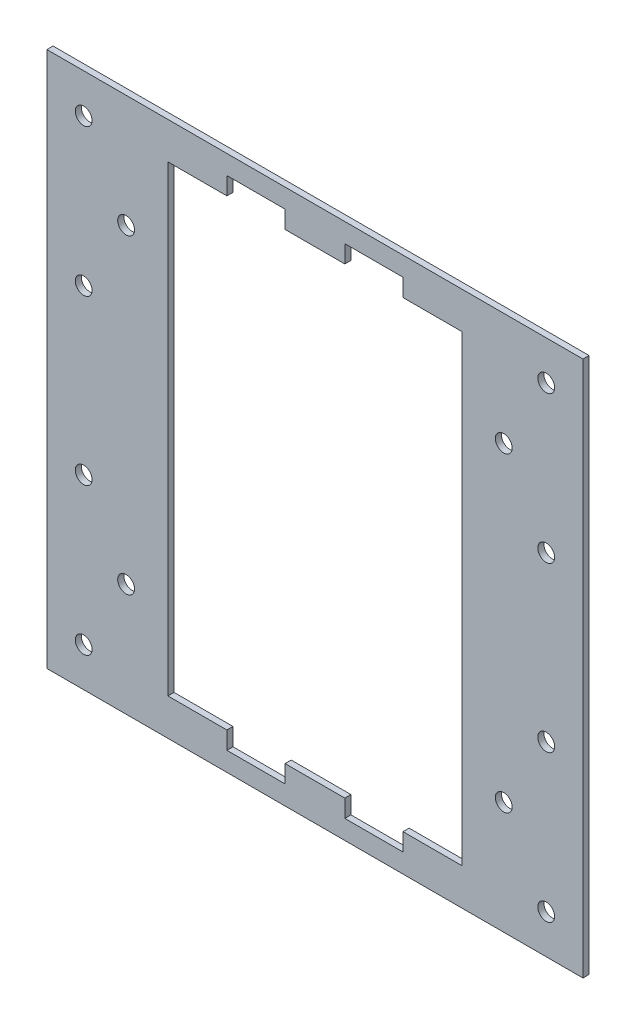
ISO-10303-21;
HEADER;
FILE_DESCRIPTION(('STEP AP214'),'2;1');
FILE_NAME('part.step','',(''),(''),'','','');
FILE_SCHEMA(('AUTOMOTIVE_DESIGN { 1 0 10303 214 1 1 1 1 }'));
ENDSEC;
DATA;
#1=APPLICATION_CONTEXT('core data for automotive mechanical design processes');
#2=APPLICATION_PROTOCOL_DEFINITION('international standard','automotive_design',2000,#1);
#3=PRODUCT_CONTEXT('',#1,'mechanical');
#4=PRODUCT('Part','Part','',(#3));
#5=PRODUCT_RELATED_PRODUCT_CATEGORY('part','',(#4));
#6=PRODUCT_DEFINITION_FORMATION('','',#4);
#7=PRODUCT_DEFINITION_CONTEXT('part definition',#1,'design');
#8=PRODUCT_DEFINITION('design','',#6,#7);
#9=PRODUCT_DEFINITION_SHAPE('','',#8);
#10=(LENGTH_UNIT() NAMED_UNIT(*) SI_UNIT(.MILLI.,.METRE.));
#11=(NAMED_UNIT(*) PLANE_ANGLE_UNIT() SI_UNIT($,.RADIAN.));
#12=(NAMED_UNIT(*) SI_UNIT($,.STERADIAN.) SOLID_ANGLE_UNIT());
#13=UNCERTAINTY_MEASURE_WITH_UNIT(LENGTH_MEASURE(1.E-05),#10,'distance_accuracy_value','');
#14=(GEOMETRIC_REPRESENTATION_CONTEXT(3) GLOBAL_UNCERTAINTY_ASSIGNED_CONTEXT((#13)) GLOBAL_UNIT_ASSIGNED_CONTEXT((#10,
#11,#12)) REPRESENTATION_CONTEXT('',''));
#15=CARTESIAN_POINT('',(0.,0.,0.));
#16=DIRECTION('',(0.,0.,1.));
#17=DIRECTION('',(1.,0.,0.));
#18=AXIS2_PLACEMENT_3D('',#15,#16,#17);
#19=CARTESIAN_POINT('',(0.,700.,8.));
#20=DIRECTION('',(1.,0.,0.));
#21=DIRECTION('',(0.,0.,-1.));
#22=AXIS2_PLACEMENT_3D('',#19,#20,#21);
#23=PLANE('',#22);
#24=DIRECTION('',(0.,-1.,0.));
#25=VECTOR('',#24,1.);
#26=CARTESIAN_POINT('',(0.,700.,0.));
#27=LINE('',#26,#25);
#28=CARTESIAN_POINT('',(0.,700.,0.));
#29=VERTEX_POINT('',#28);
#30=CARTESIAN_POINT('',(0.,0.,0.));
#31=VERTEX_POINT('',#30);
#32=EDGE_CURVE('E418',#29,#31,#27,.T.);
#33=ORIENTED_EDGE('',*,*,#32,.T.);
#34=DIRECTION('',(0.,0.,-1.));
#35=VECTOR('',#34,1.);
#36=CARTESIAN_POINT('',(0.,0.,8.));
#37=LINE('',#36,#35);
#38=CARTESIAN_POINT('',(0.,0.,8.));
#39=VERTEX_POINT('',#38);
#40=EDGE_CURVE('E447',#39,#31,#37,.T.);
#41=ORIENTED_EDGE('',*,*,#40,.F.);
#42=DIRECTION('',(0.,-1.,0.));
#43=VECTOR('',#42,1.);
#44=CARTESIAN_POINT('',(0.,700.,8.));
#45=LINE('',#44,#43);
#46=CARTESIAN_POINT('',(0.,700.,8.));
#47=VERTEX_POINT('',#46);
#48=EDGE_CURVE('E421',#47,#39,#45,.T.);
#49=ORIENTED_EDGE('',*,*,#48,.F.);
#50=DIRECTION('',(0.,0.,-1.));
#51=VECTOR('',#50,1.);
#52=CARTESIAN_POINT('',(0.,700.,8.));
#53=LINE('',#52,#51);
#54=EDGE_CURVE('E431',#47,#29,#53,.T.);
#55=ORIENTED_EDGE('',*,*,#54,.T.);
#56=EDGE_LOOP('',(#33,#41,#49,#55));
#57=FACE_BOUND('',#56,.T.);
#58=ADVANCED_FACE('F39',(#57),#23,.F.);
#59=CARTESIAN_POINT('',(0.,0.,8.));
#60=DIRECTION('',(0.,1.,0.));
#61=DIRECTION('',(0.,0.,1.));
#62=AXIS2_PLACEMENT_3D('',#59,#60,#61);
#63=PLANE('',#62);
#64=DIRECTION('',(1.,0.,0.));
#65=VECTOR('',#64,1.);
#66=CARTESIAN_POINT('',(0.,0.,0.));
#67=LINE('',#66,#65);
#68=CARTESIAN_POINT('',(700.,0.,0.));
#69=VERTEX_POINT('',#68);
#70=EDGE_CURVE('E434',#31,#69,#67,.T.);
#71=ORIENTED_EDGE('',*,*,#70,.T.);
#72=DIRECTION('',(0.,0.,-1.));
#73=VECTOR('',#72,1.);
#74=CARTESIAN_POINT('',(700.,0.,8.));
#75=LINE('',#74,#73);
#76=CARTESIAN_POINT('',(700.,0.,8.));
#77=VERTEX_POINT('',#76);
#78=EDGE_CURVE('E444',#77,#69,#75,.T.);
#79=ORIENTED_EDGE('',*,*,#78,.F.);
#80=DIRECTION('',(1.,0.,0.));
#81=VECTOR('',#80,1.);
#82=CARTESIAN_POINT('',(0.,0.,8.));
#83=LINE('',#82,#81);
#84=EDGE_CURVE('E424',#39,#77,#83,.T.);
#85=ORIENTED_EDGE('',*,*,#84,.F.);
#86=ORIENTED_EDGE('',*,*,#40,.T.);
#87=EDGE_LOOP('',(#71,#79,#85,#86));
#88=FACE_BOUND('',#87,.T.);
#89=ADVANCED_FACE('F515',(#88),#63,.F.);
#90=CARTESIAN_POINT('',(700.,0.,8.));
#91=DIRECTION('',(-1.,0.,0.));
#92=DIRECTION('',(0.,0.,1.));
#93=AXIS2_PLACEMENT_3D('',#90,#91,#92);
#94=PLANE('',#93);
#95=DIRECTION('',(0.,1.,0.));
#96=VECTOR('',#95,1.);
#97=CARTESIAN_POINT('',(700.,0.,0.));
#98=LINE('',#97,#96);
#99=CARTESIAN_POINT('',(700.,700.,0.));
#100=VERTEX_POINT('',#99);
#101=EDGE_CURVE('E436',#69,#100,#98,.T.);
#102=ORIENTED_EDGE('',*,*,#101,.T.);
#103=DIRECTION('',(0.,0.,-1.));
#104=VECTOR('',#103,1.);
#105=CARTESIAN_POINT('',(700.,700.,8.));
#106=LINE('',#105,#104);
#107=CARTESIAN_POINT('',(700.,700.,8.));
#108=VERTEX_POINT('',#107);
#109=EDGE_CURVE('E441',#108,#100,#106,.T.);
#110=ORIENTED_EDGE('',*,*,#109,.F.);
#111=DIRECTION('',(0.,1.,0.));
#112=VECTOR('',#111,1.);
#113=CARTESIAN_POINT('',(700.,0.,8.));
#114=LINE('',#113,#112);
#115=EDGE_CURVE('E427',#77,#108,#114,.T.);
#116=ORIENTED_EDGE('',*,*,#115,.F.);
#117=ORIENTED_EDGE('',*,*,#78,.T.);
#118=EDGE_LOOP('',(#102,#110,#116,#117));
#119=FACE_BOUND('',#118,.T.);
#120=ADVANCED_FACE('F520',(#119),#94,.F.);
#121=CARTESIAN_POINT('',(700.,700.,8.));
#122=DIRECTION('',(0.,-1.,0.));
#123=DIRECTION('',(0.,0.,-1.));
#124=AXIS2_PLACEMENT_3D('',#121,#122,#123);
#125=PLANE('',#124);
#126=DIRECTION('',(-1.,0.,0.));
#127=VECTOR('',#126,1.);
#128=CARTESIAN_POINT('',(700.,700.,0.));
#129=LINE('',#128,#127);
#130=EDGE_CURVE('E425',#100,#29,#129,.T.);
#131=ORIENTED_EDGE('',*,*,#130,.T.);
#132=ORIENTED_EDGE('',*,*,#54,.F.);
#133=DIRECTION('',(-1.,0.,0.));
#134=VECTOR('',#133,1.);
#135=CARTESIAN_POINT('',(700.,700.,8.));
#136=LINE('',#135,#134);
#137=EDGE_CURVE('E429',#108,#47,#136,.T.);
#138=ORIENTED_EDGE('',*,*,#137,.F.);
#139=ORIENTED_EDGE('',*,*,#109,.T.);
#140=EDGE_LOOP('',(#131,#132,#138,#139));
#141=FACE_BOUND('',#140,.T.);
#142=ADVANCED_FACE('F534',(#141),#125,.F.);
#143=CARTESIAN_POINT('',(0.,0.,8.));
#144=DIRECTION('',(0.,0.,1.));
#145=DIRECTION('',(1.,0.,0.));
#146=AXIS2_PLACEMENT_3D('',#143,#144,#145);
#147=PLANE('',#146);
#148=DIRECTION('',(-1.,0.,0.));
#149=VECTOR('',#148,1.);
#150=CARTESIAN_POINT('',(542.,652.,8.));
#151=LINE('',#150,#149);
#152=CARTESIAN_POINT('',(389.,652.,8.));
#153=VERTEX_POINT('',#152);
#154=CARTESIAN_POINT('',(311.,652.,8.));
#155=VERTEX_POINT('',#154);
#156=EDGE_CURVE('E230',#153,#155,#151,.T.);
#157=ORIENTED_EDGE('',*,*,#156,.F.);
#158=DIRECTION('',(0.,-1.,0.));
#159=VECTOR('',#158,1.);
#160=CARTESIAN_POINT('',(389.,675.,8.));
#161=LINE('',#160,#159);
#162=CARTESIAN_POINT('',(389.,675.,8.));
#163=VERTEX_POINT('',#162);
#164=EDGE_CURVE('E336',#163,#153,#161,.T.);
#165=ORIENTED_EDGE('',*,*,#164,.F.);
#166=DIRECTION('',(-1.,0.,0.));
#167=VECTOR('',#166,1.);
#168=CARTESIAN_POINT('',(465.,675.,8.));
#169=LINE('',#168,#167);
#170=CARTESIAN_POINT('',(465.,675.,8.));
#171=VERTEX_POINT('',#170);
#172=EDGE_CURVE('E342',#171,#163,#169,.T.);
#173=ORIENTED_EDGE('',*,*,#172,.F.);
#174=DIRECTION('',(0.,1.,0.));
#175=VECTOR('',#174,1.);
#176=CARTESIAN_POINT('',(465.,375.,8.));
#177=LINE('',#176,#175);
#178=CARTESIAN_POINT('',(465.,652.,8.));
#179=VERTEX_POINT('',#178);
#180=EDGE_CURVE('E350',#179,#171,#177,.T.);
#181=ORIENTED_EDGE('',*,*,#180,.F.);
#182=CARTESIAN_POINT('',(542.,652.,8.));
#183=VERTEX_POINT('',#182);
#184=EDGE_CURVE('E227',#183,#179,#151,.T.);
#185=ORIENTED_EDGE('',*,*,#184,.F.);
#186=DIRECTION('',(0.,1.,0.));
#187=VECTOR('',#186,1.);
#188=CARTESIAN_POINT('',(542.,48.,8.));
#189=LINE('',#188,#187);
#190=CARTESIAN_POINT('',(542.,48.,8.));
#191=VERTEX_POINT('',#190);
#192=EDGE_CURVE('E243',#191,#183,#189,.T.);
#193=ORIENTED_EDGE('',*,*,#192,.F.);
#194=DIRECTION('',(1.,0.,0.));
#195=VECTOR('',#194,1.);
#196=CARTESIAN_POINT('',(158.,48.,8.));
#197=LINE('',#196,#195);
#198=CARTESIAN_POINT('',(465.,48.,8.));
#199=VERTEX_POINT('',#198);
#200=EDGE_CURVE('E240',#199,#191,#197,.T.);
#201=ORIENTED_EDGE('',*,*,#200,.F.);
#202=DIRECTION('',(0.,1.,0.));
#203=VECTOR('',#202,1.);
#204=CARTESIAN_POINT('',(465.,25.,8.));
#205=LINE('',#204,#203);
#206=CARTESIAN_POINT('',(465.,25.,8.));
#207=VERTEX_POINT('',#206);
#208=EDGE_CURVE('E362',#207,#199,#205,.T.);
#209=ORIENTED_EDGE('',*,*,#208,.F.);
#210=DIRECTION('',(1.,0.,0.));
#211=VECTOR('',#210,1.);
#212=CARTESIAN_POINT('',(389.,25.,8.));
#213=LINE('',#212,#211);
#214=CARTESIAN_POINT('',(389.,25.,8.));
#215=VERTEX_POINT('',#214);
#216=EDGE_CURVE('E370',#215,#207,#213,.T.);
#217=ORIENTED_EDGE('',*,*,#216,.F.);
#218=DIRECTION('',(0.,-1.,0.));
#219=VECTOR('',#218,1.);
#220=CARTESIAN_POINT('',(389.,325.,8.));
#221=LINE('',#220,#219);
#222=CARTESIAN_POINT('',(389.,48.,8.));
#223=VERTEX_POINT('',#222);
#224=EDGE_CURVE('E356',#223,#215,#221,.T.);
#225=ORIENTED_EDGE('',*,*,#224,.F.);
#226=CARTESIAN_POINT('',(311.,48.,8.));
#227=VERTEX_POINT('',#226);
#228=EDGE_CURVE('E61',#227,#223,#197,.T.);
#229=ORIENTED_EDGE('',*,*,#228,.F.);
#230=DIRECTION('',(0.,1.,0.));
#231=VECTOR('',#230,1.);
#232=CARTESIAN_POINT('',(311.,25.,8.));
#233=LINE('',#232,#231);
#234=CARTESIAN_POINT('',(311.,25.,8.));
#235=VERTEX_POINT('',#234);
#236=EDGE_CURVE('E403',#235,#227,#233,.T.);
#237=ORIENTED_EDGE('',*,*,#236,.F.);
#238=DIRECTION('',(1.,0.,0.));
#239=VECTOR('',#238,1.);
#240=CARTESIAN_POINT('',(235.,25.,8.));
#241=LINE('',#240,#239);
#242=CARTESIAN_POINT('',(235.,25.,8.));
#243=VERTEX_POINT('',#242);
#244=EDGE_CURVE('E411',#243,#235,#241,.T.);
#245=ORIENTED_EDGE('',*,*,#244,.F.);
#246=DIRECTION('',(0.,-1.,0.));
#247=VECTOR('',#246,1.);
#248=CARTESIAN_POINT('',(235.,325.,8.));
#249=LINE('',#248,#247);
#250=CARTESIAN_POINT('',(235.,48.,8.));
#251=VERTEX_POINT('',#250);
#252=EDGE_CURVE('E397',#251,#243,#249,.T.);
#253=ORIENTED_EDGE('',*,*,#252,.F.);
#254=CARTESIAN_POINT('',(158.,48.,8.));
#255=VERTEX_POINT('',#254);
#256=EDGE_CURVE('E241',#255,#251,#197,.T.);
#257=ORIENTED_EDGE('',*,*,#256,.F.);
#258=DIRECTION('',(0.,-1.,0.));
#259=VECTOR('',#258,1.);
#260=CARTESIAN_POINT('',(158.,652.,8.));
#261=LINE('',#260,#259);
#262=CARTESIAN_POINT('',(158.,652.,8.));
#263=VERTEX_POINT('',#262);
#264=EDGE_CURVE('E206',#263,#255,#261,.T.);
#265=ORIENTED_EDGE('',*,*,#264,.F.);
#266=CARTESIAN_POINT('',(235.,652.,8.));
#267=VERTEX_POINT('',#266);
#268=EDGE_CURVE('E232',#267,#263,#151,.T.);
#269=ORIENTED_EDGE('',*,*,#268,.F.);
#270=DIRECTION('',(0.,-1.,0.));
#271=VECTOR('',#270,1.);
#272=CARTESIAN_POINT('',(235.,675.,8.));
#273=LINE('',#272,#271);
#274=CARTESIAN_POINT('',(235.,675.,8.));
#275=VERTEX_POINT('',#274);
#276=EDGE_CURVE('E377',#275,#267,#273,.T.);
#277=ORIENTED_EDGE('',*,*,#276,.F.);
#278=DIRECTION('',(-1.,0.,0.));
#279=VECTOR('',#278,1.);
#280=CARTESIAN_POINT('',(311.,675.,8.));
#281=LINE('',#280,#279);
#282=CARTESIAN_POINT('',(311.,675.,8.));
#283=VERTEX_POINT('',#282);
#284=EDGE_CURVE('E383',#283,#275,#281,.T.);
#285=ORIENTED_EDGE('',*,*,#284,.F.);
#286=DIRECTION('',(0.,1.,0.));
#287=VECTOR('',#286,1.);
#288=CARTESIAN_POINT('',(311.,375.,8.));
#289=LINE('',#288,#287);
#290=EDGE_CURVE('E391',#155,#283,#289,.T.);
#291=ORIENTED_EDGE('',*,*,#290,.F.);
#292=EDGE_LOOP('',(#157,#165,#173,#181,#185,#193,#201,#209,#217,#225,#229,#237,#245,#253,#257,
#265,#269,#277,#285,#291));
#293=FACE_BOUND('',#292,.T.);
#294=CARTESIAN_POINT('',(596.57,553.,8.));
#295=DIRECTION('',(0.,0.,1.));
#296=DIRECTION('',(1.,0.,0.));
#297=AXIS2_PLACEMENT_3D('',#294,#295,#296);
#298=CIRCLE('',#297,11.);
#299=CARTESIAN_POINT('',(607.57,553.,8.));
#300=VERTEX_POINT('',#299);
#301=EDGE_CURVE('E266',#300,#300,#298,.T.);
#302=ORIENTED_EDGE('',*,*,#301,.F.);
#303=EDGE_LOOP('',(#302));
#304=FACE_BOUND('',#303,.T.);
#305=CARTESIAN_POINT('',(596.57,147.,8.));
#306=DIRECTION('',(0.,0.,1.));
#307=DIRECTION('',(1.,0.,0.));
#308=AXIS2_PLACEMENT_3D('',#305,#306,#307);
#309=CIRCLE('',#308,11.);
#310=CARTESIAN_POINT('',(607.57,147.,8.));
#311=VERTEX_POINT('',#310);
#312=EDGE_CURVE('E270',#311,#311,#309,.T.);
#313=ORIENTED_EDGE('',*,*,#312,.F.);
#314=EDGE_LOOP('',(#313));
#315=FACE_BOUND('',#314,.T.);
#316=CARTESIAN_POINT('',(652.,649.,8.));
#317=DIRECTION('',(0.,0.,1.));
#318=DIRECTION('',(1.,0.,0.));
#319=AXIS2_PLACEMENT_3D('',#316,#317,#318);
#320=CIRCLE('',#319,11.);
#321=CARTESIAN_POINT('',(663.,649.,8.));
#322=VERTEX_POINT('',#321);
#323=EDGE_CURVE('E276',#322,#322,#320,.T.);
#324=ORIENTED_EDGE('',*,*,#323,.F.);
#325=EDGE_LOOP('',(#324));
#326=FACE_BOUND('',#325,.T.);
#327=CARTESIAN_POINT('',(652.,457.,8.));
#328=DIRECTION('',(0.,0.,1.));
#329=DIRECTION('',(1.,0.,0.));
#330=AXIS2_PLACEMENT_3D('',#327,#328,#329);
#331=CIRCLE('',#330,11.);
#332=CARTESIAN_POINT('',(663.,457.,8.));
#333=VERTEX_POINT('',#332);
#334=EDGE_CURVE('E282',#333,#333,#331,.T.);
#335=ORIENTED_EDGE('',*,*,#334,.F.);
#336=EDGE_LOOP('',(#335));
#337=FACE_BOUND('',#336,.T.);
#338=CARTESIAN_POINT('',(652.,243.,8.));
#339=DIRECTION('',(0.,0.,1.));
#340=DIRECTION('',(1.,0.,0.));
#341=AXIS2_PLACEMENT_3D('',#338,#339,#340);
#342=CIRCLE('',#341,11.);
#343=CARTESIAN_POINT('',(663.,243.,8.));
#344=VERTEX_POINT('',#343);
#345=EDGE_CURVE('E288',#344,#344,#342,.T.);
#346=ORIENTED_EDGE('',*,*,#345,.F.);
#347=EDGE_LOOP('',(#346));
#348=FACE_BOUND('',#347,.T.);
#349=CARTESIAN_POINT('',(652.,51.,8.));
#350=DIRECTION('',(0.,0.,1.));
#351=DIRECTION('',(1.,0.,0.));
#352=AXIS2_PLACEMENT_3D('',#349,#350,#351);
#353=CIRCLE('',#352,11.);
#354=CARTESIAN_POINT('',(663.,51.,8.));
#355=VERTEX_POINT('',#354);
#356=EDGE_CURVE('E294',#355,#355,#353,.T.);
#357=ORIENTED_EDGE('',*,*,#356,.F.);
#358=EDGE_LOOP('',(#357));
#359=FACE_BOUND('',#358,.T.);
#360=CARTESIAN_POINT('',(103.43,553.,8.));
#361=DIRECTION('',(0.,0.,1.));
#362=DIRECTION('',(1.,0.,0.));
#363=AXIS2_PLACEMENT_3D('',#360,#361,#362);
#364=CIRCLE('',#363,11.);
#365=CARTESIAN_POINT('',(114.43,553.,8.));
#366=VERTEX_POINT('',#365);
#367=EDGE_CURVE('E300',#366,#366,#364,.T.);
#368=ORIENTED_EDGE('',*,*,#367,.F.);
#369=EDGE_LOOP('',(#368));
#370=FACE_BOUND('',#369,.T.);
#371=CARTESIAN_POINT('',(103.43,147.,8.));
#372=DIRECTION('',(0.,0.,1.));
#373=DIRECTION('',(1.,0.,0.));
#374=AXIS2_PLACEMENT_3D('',#371,#372,#373);
#375=CIRCLE('',#374,11.);
#376=CARTESIAN_POINT('',(114.43,147.,8.));
#377=VERTEX_POINT('',#376);
#378=EDGE_CURVE('E306',#377,#377,#375,.T.);
#379=ORIENTED_EDGE('',*,*,#378,.F.);
#380=EDGE_LOOP('',(#379));
#381=FACE_BOUND('',#380,.T.);
#382=CARTESIAN_POINT('',(48.,649.,8.));
#383=DIRECTION('',(0.,0.,1.));
#384=DIRECTION('',(1.,0.,0.));
#385=AXIS2_PLACEMENT_3D('',#382,#383,#384);
#386=CIRCLE('',#385,11.);
#387=CARTESIAN_POINT('',(59.,649.,8.));
#388=VERTEX_POINT('',#387);
#389=EDGE_CURVE('E312',#388,#388,#386,.T.);
#390=ORIENTED_EDGE('',*,*,#389,.F.);
#391=EDGE_LOOP('',(#390));
#392=FACE_BOUND('',#391,.T.);
#393=CARTESIAN_POINT('',(48.,457.,8.));
#394=DIRECTION('',(0.,0.,1.));
#395=DIRECTION('',(1.,0.,0.));
#396=AXIS2_PLACEMENT_3D('',#393,#394,#395);
#397=CIRCLE('',#396,11.);
#398=CARTESIAN_POINT('',(59.,457.,8.));
#399=VERTEX_POINT('',#398);
#400=EDGE_CURVE('E318',#399,#399,#397,.T.);
#401=ORIENTED_EDGE('',*,*,#400,.F.);
#402=EDGE_LOOP('',(#401));
#403=FACE_BOUND('',#402,.T.);
#404=CARTESIAN_POINT('',(48.,243.,8.));
#405=DIRECTION('',(0.,0.,1.));
#406=DIRECTION('',(1.,0.,0.));
#407=AXIS2_PLACEMENT_3D('',#404,#405,#406);
#408=CIRCLE('',#407,11.);
#409=CARTESIAN_POINT('',(59.,243.,8.));
#410=VERTEX_POINT('',#409);
#411=EDGE_CURVE('E324',#410,#410,#408,.T.);
#412=ORIENTED_EDGE('',*,*,#411,.F.);
#413=EDGE_LOOP('',(#412));
#414=FACE_BOUND('',#413,.T.);
#415=CARTESIAN_POINT('',(48.,51.,8.));
#416=DIRECTION('',(0.,0.,1.));
#417=DIRECTION('',(1.,0.,0.));
#418=AXIS2_PLACEMENT_3D('',#415,#416,#417);
#419=CIRCLE('',#418,11.);
#420=CARTESIAN_POINT('',(59.,51.,8.));
#421=VERTEX_POINT('',#420);
#422=EDGE_CURVE('E330',#421,#421,#419,.T.);
#423=ORIENTED_EDGE('',*,*,#422,.F.);
#424=EDGE_LOOP('',(#423));
#425=FACE_BOUND('',#424,.T.);
#426=ORIENTED_EDGE('',*,*,#48,.T.);
#427=ORIENTED_EDGE('',*,*,#84,.T.);
#428=ORIENTED_EDGE('',*,*,#115,.T.);
#429=ORIENTED_EDGE('',*,*,#137,.T.);
#430=EDGE_LOOP('',(#426,#427,#428,#429));
#431=FACE_BOUND('',#430,.T.);
#432=ADVANCED_FACE('F461',(#293,#304,#315,#326,#337,#348,#359,#370,#381,#392,#403,#414,#425,
#431),#147,.T.);
#433=CARTESIAN_POINT('',(0.,0.,0.));
#434=DIRECTION('',(0.,0.,1.));
#435=DIRECTION('',(1.,0.,0.));
#436=AXIS2_PLACEMENT_3D('',#433,#434,#435);
#437=PLANE('',#436);
#438=CARTESIAN_POINT('',(596.57,553.,0.));
#439=DIRECTION('',(0.,0.,1.));
#440=DIRECTION('',(1.,0.,0.));
#441=AXIS2_PLACEMENT_3D('',#438,#439,#440);
#442=CIRCLE('',#441,11.);
#443=CARTESIAN_POINT('',(607.57,553.,0.));
#444=VERTEX_POINT('',#443);
#445=EDGE_CURVE('E267',#444,#444,#442,.T.);
#446=ORIENTED_EDGE('',*,*,#445,.T.);
#447=EDGE_LOOP('',(#446));
#448=FACE_BOUND('',#447,.T.);
#449=CARTESIAN_POINT('',(596.57,147.,0.));
#450=DIRECTION('',(0.,0.,1.));
#451=DIRECTION('',(1.,0.,0.));
#452=AXIS2_PLACEMENT_3D('',#449,#450,#451);
#453=CIRCLE('',#452,11.);
#454=CARTESIAN_POINT('',(607.57,147.,0.));
#455=VERTEX_POINT('',#454);
#456=EDGE_CURVE('E273',#455,#455,#453,.T.);
#457=ORIENTED_EDGE('',*,*,#456,.T.);
#458=EDGE_LOOP('',(#457));
#459=FACE_BOUND('',#458,.T.);
#460=CARTESIAN_POINT('',(652.,649.,0.));
#461=DIRECTION('',(0.,0.,1.));
#462=DIRECTION('',(1.,0.,0.));
#463=AXIS2_PLACEMENT_3D('',#460,#461,#462);
#464=CIRCLE('',#463,11.);
#465=CARTESIAN_POINT('',(663.,649.,0.));
#466=VERTEX_POINT('',#465);
#467=EDGE_CURVE('E279',#466,#466,#464,.T.);
#468=ORIENTED_EDGE('',*,*,#467,.T.);
#469=EDGE_LOOP('',(#468));
#470=FACE_BOUND('',#469,.T.);
#471=CARTESIAN_POINT('',(652.,457.,0.));
#472=DIRECTION('',(0.,0.,1.));
#473=DIRECTION('',(1.,0.,0.));
#474=AXIS2_PLACEMENT_3D('',#471,#472,#473);
#475=CIRCLE('',#474,11.);
#476=CARTESIAN_POINT('',(663.,457.,0.));
#477=VERTEX_POINT('',#476);
#478=EDGE_CURVE('E285',#477,#477,#475,.T.);
#479=ORIENTED_EDGE('',*,*,#478,.T.);
#480=EDGE_LOOP('',(#479));
#481=FACE_BOUND('',#480,.T.);
#482=CARTESIAN_POINT('',(652.,243.,0.));
#483=DIRECTION('',(0.,0.,1.));
#484=DIRECTION('',(1.,0.,0.));
#485=AXIS2_PLACEMENT_3D('',#482,#483,#484);
#486=CIRCLE('',#485,11.);
#487=CARTESIAN_POINT('',(663.,243.,0.));
#488=VERTEX_POINT('',#487);
#489=EDGE_CURVE('E291',#488,#488,#486,.T.);
#490=ORIENTED_EDGE('',*,*,#489,.T.);
#491=EDGE_LOOP('',(#490));
#492=FACE_BOUND('',#491,.T.);
#493=CARTESIAN_POINT('',(652.,51.,0.));
#494=DIRECTION('',(0.,0.,1.));
#495=DIRECTION('',(1.,0.,0.));
#496=AXIS2_PLACEMENT_3D('',#493,#494,#495);
#497=CIRCLE('',#496,11.);
#498=CARTESIAN_POINT('',(663.,51.,0.));
#499=VERTEX_POINT('',#498);
#500=EDGE_CURVE('E297',#499,#499,#497,.T.);
#501=ORIENTED_EDGE('',*,*,#500,.T.);
#502=EDGE_LOOP('',(#501));
#503=FACE_BOUND('',#502,.T.);
#504=CARTESIAN_POINT('',(103.43,553.,0.));
#505=DIRECTION('',(0.,0.,1.));
#506=DIRECTION('',(1.,0.,0.));
#507=AXIS2_PLACEMENT_3D('',#504,#505,#506);
#508=CIRCLE('',#507,11.);
#509=CARTESIAN_POINT('',(114.43,553.,0.));
#510=VERTEX_POINT('',#509);
#511=EDGE_CURVE('E303',#510,#510,#508,.T.);
#512=ORIENTED_EDGE('',*,*,#511,.T.);
#513=EDGE_LOOP('',(#512));
#514=FACE_BOUND('',#513,.T.);
#515=CARTESIAN_POINT('',(103.43,147.,0.));
#516=DIRECTION('',(0.,0.,1.));
#517=DIRECTION('',(1.,0.,0.));
#518=AXIS2_PLACEMENT_3D('',#515,#516,#517);
#519=CIRCLE('',#518,11.);
#520=CARTESIAN_POINT('',(114.43,147.,0.));
#521=VERTEX_POINT('',#520);
#522=EDGE_CURVE('E309',#521,#521,#519,.T.);
#523=ORIENTED_EDGE('',*,*,#522,.T.);
#524=EDGE_LOOP('',(#523));
#525=FACE_BOUND('',#524,.T.);
#526=CARTESIAN_POINT('',(48.,649.,0.));
#527=DIRECTION('',(0.,0.,1.));
#528=DIRECTION('',(1.,0.,0.));
#529=AXIS2_PLACEMENT_3D('',#526,#527,#528);
#530=CIRCLE('',#529,11.);
#531=CARTESIAN_POINT('',(59.,649.,0.));
#532=VERTEX_POINT('',#531);
#533=EDGE_CURVE('E315',#532,#532,#530,.T.);
#534=ORIENTED_EDGE('',*,*,#533,.T.);
#535=EDGE_LOOP('',(#534));
#536=FACE_BOUND('',#535,.T.);
#537=CARTESIAN_POINT('',(48.,457.,0.));
#538=DIRECTION('',(0.,0.,1.));
#539=DIRECTION('',(1.,0.,0.));
#540=AXIS2_PLACEMENT_3D('',#537,#538,#539);
#541=CIRCLE('',#540,11.);
#542=CARTESIAN_POINT('',(59.,457.,0.));
#543=VERTEX_POINT('',#542);
#544=EDGE_CURVE('E321',#543,#543,#541,.T.);
#545=ORIENTED_EDGE('',*,*,#544,.T.);
#546=EDGE_LOOP('',(#545));
#547=FACE_BOUND('',#546,.T.);
#548=CARTESIAN_POINT('',(48.,243.,0.));
#549=DIRECTION('',(0.,0.,1.));
#550=DIRECTION('',(1.,0.,0.));
#551=AXIS2_PLACEMENT_3D('',#548,#549,#550);
#552=CIRCLE('',#551,11.);
#553=CARTESIAN_POINT('',(59.,243.,0.));
#554=VERTEX_POINT('',#553);
#555=EDGE_CURVE('E327',#554,#554,#552,.T.);
#556=ORIENTED_EDGE('',*,*,#555,.T.);
#557=EDGE_LOOP('',(#556));
#558=FACE_BOUND('',#557,.T.);
#559=CARTESIAN_POINT('',(48.,51.,0.));
#560=DIRECTION('',(0.,0.,1.));
#561=DIRECTION('',(1.,0.,0.));
#562=AXIS2_PLACEMENT_3D('',#559,#560,#561);
#563=CIRCLE('',#562,11.);
#564=CARTESIAN_POINT('',(59.,51.,0.));
#565=VERTEX_POINT('',#564);
#566=EDGE_CURVE('E333',#565,#565,#563,.T.);
#567=ORIENTED_EDGE('',*,*,#566,.T.);
#568=EDGE_LOOP('',(#567));
#569=FACE_BOUND('',#568,.T.);
#570=DIRECTION('',(0.,-1.,0.));
#571=VECTOR('',#570,1.);
#572=CARTESIAN_POINT('',(389.,675.,0.));
#573=LINE('',#572,#571);
#574=CARTESIAN_POINT('',(389.,675.,0.));
#575=VERTEX_POINT('',#574);
#576=CARTESIAN_POINT('',(389.,652.,0.));
#577=VERTEX_POINT('',#576);
#578=EDGE_CURVE('E339',#575,#577,#573,.T.);
#579=ORIENTED_EDGE('',*,*,#578,.T.);
#580=DIRECTION('',(-1.,0.,0.));
#581=VECTOR('',#580,1.);
#582=CARTESIAN_POINT('',(542.,652.,0.));
#583=LINE('',#582,#581);
#584=CARTESIAN_POINT('',(311.,652.,0.));
#585=VERTEX_POINT('',#584);
#586=EDGE_CURVE('E238',#577,#585,#583,.T.);
#587=ORIENTED_EDGE('',*,*,#586,.T.);
#588=DIRECTION('',(0.,1.,0.));
#589=VECTOR('',#588,1.);
#590=CARTESIAN_POINT('',(311.,375.,0.));
#591=LINE('',#590,#589);
#592=CARTESIAN_POINT('',(311.,675.,0.));
#593=VERTEX_POINT('',#592);
#594=EDGE_CURVE('E382',#585,#593,#591,.T.);
#595=ORIENTED_EDGE('',*,*,#594,.T.);
#596=DIRECTION('',(-1.,0.,0.));
#597=VECTOR('',#596,1.);
#598=CARTESIAN_POINT('',(311.,675.,0.));
#599=LINE('',#598,#597);
#600=CARTESIAN_POINT('',(235.,675.,0.));
#601=VERTEX_POINT('',#600);
#602=EDGE_CURVE('E385',#593,#601,#599,.T.);
#603=ORIENTED_EDGE('',*,*,#602,.T.);
#604=DIRECTION('',(0.,-1.,0.));
#605=VECTOR('',#604,1.);
#606=CARTESIAN_POINT('',(235.,675.,0.));
#607=LINE('',#606,#605);
#608=CARTESIAN_POINT('',(235.,652.,0.));
#609=VERTEX_POINT('',#608);
#610=EDGE_CURVE('E380',#601,#609,#607,.T.);
#611=ORIENTED_EDGE('',*,*,#610,.T.);
#612=CARTESIAN_POINT('',(158.,652.,0.));
#613=VERTEX_POINT('',#612);
#614=EDGE_CURVE('E53',#609,#613,#583,.T.);
#615=ORIENTED_EDGE('',*,*,#614,.T.);
#616=DIRECTION('',(0.,-1.,0.));
#617=VECTOR('',#616,1.);
#618=CARTESIAN_POINT('',(158.,652.,0.));
#619=LINE('',#618,#617);
#620=CARTESIAN_POINT('',(158.,48.,0.));
#621=VERTEX_POINT('',#620);
#622=EDGE_CURVE('E204',#613,#621,#619,.T.);
#623=ORIENTED_EDGE('',*,*,#622,.T.);
#624=DIRECTION('',(1.,0.,0.));
#625=VECTOR('',#624,1.);
#626=CARTESIAN_POINT('',(158.,48.,0.));
#627=LINE('',#626,#625);
#628=CARTESIAN_POINT('',(235.,48.,0.));
#629=VERTEX_POINT('',#628);
#630=EDGE_CURVE('E213',#621,#629,#627,.T.);
#631=ORIENTED_EDGE('',*,*,#630,.T.);
#632=DIRECTION('',(0.,-1.,0.));
#633=VECTOR('',#632,1.);
#634=CARTESIAN_POINT('',(235.,325.,0.));
#635=LINE('',#634,#633);
#636=CARTESIAN_POINT('',(235.,25.,0.));
#637=VERTEX_POINT('',#636);
#638=EDGE_CURVE('E400',#629,#637,#635,.T.);
#639=ORIENTED_EDGE('',*,*,#638,.T.);
#640=DIRECTION('',(1.,0.,0.));
#641=VECTOR('',#640,1.);
#642=CARTESIAN_POINT('',(235.,25.,0.));
#643=LINE('',#642,#641);
#644=CARTESIAN_POINT('',(311.,25.,0.));
#645=VERTEX_POINT('',#644);
#646=EDGE_CURVE('E402',#637,#645,#643,.T.);
#647=ORIENTED_EDGE('',*,*,#646,.T.);
#648=DIRECTION('',(0.,1.,0.));
#649=VECTOR('',#648,1.);
#650=CARTESIAN_POINT('',(311.,25.,0.));
#651=LINE('',#650,#649);
#652=CARTESIAN_POINT('',(311.,48.,0.));
#653=VERTEX_POINT('',#652);
#654=EDGE_CURVE('E406',#645,#653,#651,.T.);
#655=ORIENTED_EDGE('',*,*,#654,.T.);
#656=CARTESIAN_POINT('',(389.,48.,0.));
#657=VERTEX_POINT('',#656);
#658=EDGE_CURVE('E220',#653,#657,#627,.T.);
#659=ORIENTED_EDGE('',*,*,#658,.T.);
#660=DIRECTION('',(0.,-1.,0.));
#661=VECTOR('',#660,1.);
#662=CARTESIAN_POINT('',(389.,325.,0.));
#663=LINE('',#662,#661);
#664=CARTESIAN_POINT('',(389.,25.,0.));
#665=VERTEX_POINT('',#664);
#666=EDGE_CURVE('E359',#657,#665,#663,.T.);
#667=ORIENTED_EDGE('',*,*,#666,.T.);
#668=DIRECTION('',(1.,0.,0.));
#669=VECTOR('',#668,1.);
#670=CARTESIAN_POINT('',(389.,25.,0.));
#671=LINE('',#670,#669);
#672=CARTESIAN_POINT('',(465.,25.,0.));
#673=VERTEX_POINT('',#672);
#674=EDGE_CURVE('E361',#665,#673,#671,.T.);
#675=ORIENTED_EDGE('',*,*,#674,.T.);
#676=DIRECTION('',(0.,1.,0.));
#677=VECTOR('',#676,1.);
#678=CARTESIAN_POINT('',(465.,25.,0.));
#679=LINE('',#678,#677);
#680=CARTESIAN_POINT('',(465.,48.,0.));
#681=VERTEX_POINT('',#680);
#682=EDGE_CURVE('E365',#673,#681,#679,.T.);
#683=ORIENTED_EDGE('',*,*,#682,.T.);
#684=CARTESIAN_POINT('',(542.,48.,0.));
#685=VERTEX_POINT('',#684);
#686=EDGE_CURVE('E222',#681,#685,#627,.T.);
#687=ORIENTED_EDGE('',*,*,#686,.T.);
#688=DIRECTION('',(0.,1.,0.));
#689=VECTOR('',#688,1.);
#690=CARTESIAN_POINT('',(542.,48.,0.));
#691=LINE('',#690,#689);
#692=CARTESIAN_POINT('',(542.,652.,0.));
#693=VERTEX_POINT('',#692);
#694=EDGE_CURVE('E219',#685,#693,#691,.T.);
#695=ORIENTED_EDGE('',*,*,#694,.T.);
#696=CARTESIAN_POINT('',(465.,652.,0.));
#697=VERTEX_POINT('',#696);
#698=EDGE_CURVE('E210',#693,#697,#583,.T.);
#699=ORIENTED_EDGE('',*,*,#698,.T.);
#700=DIRECTION('',(0.,1.,0.));
#701=VECTOR('',#700,1.);
#702=CARTESIAN_POINT('',(465.,375.,0.));
#703=LINE('',#702,#701);
#704=CARTESIAN_POINT('',(465.,675.,0.));
#705=VERTEX_POINT('',#704);
#706=EDGE_CURVE('E341',#697,#705,#703,.T.);
#707=ORIENTED_EDGE('',*,*,#706,.T.);
#708=DIRECTION('',(-1.,0.,0.));
#709=VECTOR('',#708,1.);
#710=CARTESIAN_POINT('',(465.,675.,0.));
#711=LINE('',#710,#709);
#712=EDGE_CURVE('E344',#705,#575,#711,.T.);
#713=ORIENTED_EDGE('',*,*,#712,.T.);
#714=EDGE_LOOP('',(#579,#587,#595,#603,#611,#615,#623,#631,#639,#647,#655,#659,#667,#675,#683,
#687,#695,#699,#707,#713));
#715=FACE_BOUND('',#714,.T.);
#716=ORIENTED_EDGE('',*,*,#32,.F.);
#717=ORIENTED_EDGE('',*,*,#130,.F.);
#718=ORIENTED_EDGE('',*,*,#101,.F.);
#719=ORIENTED_EDGE('',*,*,#70,.F.);
#720=EDGE_LOOP('',(#716,#717,#718,#719));
#721=FACE_BOUND('',#720,.T.);
#722=ADVANCED_FACE('F224',(#448,#459,#470,#481,#492,#503,#514,#525,#536,#547,#558,#569,#715,
#721),#437,.F.);
#723=CARTESIAN_POINT('',(235.,325.,0.));
#724=DIRECTION('',(-1.,0.,0.));
#725=DIRECTION('',(0.,0.,1.));
#726=AXIS2_PLACEMENT_3D('',#723,#724,#725);
#727=PLANE('',#726);
#728=ORIENTED_EDGE('',*,*,#638,.F.);
#729=DIRECTION('',(0.,0.,1.));
#730=VECTOR('',#729,1.);
#731=CARTESIAN_POINT('',(235.,48.,0.));
#732=LINE('',#731,#730);
#733=EDGE_CURVE('E216',#629,#251,#732,.T.);
#734=ORIENTED_EDGE('',*,*,#733,.T.);
#735=ORIENTED_EDGE('',*,*,#252,.T.);
#736=DIRECTION('',(0.,0.,1.));
#737=VECTOR('',#736,1.);
#738=CARTESIAN_POINT('',(235.,25.,0.));
#739=LINE('',#738,#737);
#740=EDGE_CURVE('E409',#637,#243,#739,.T.);
#741=ORIENTED_EDGE('',*,*,#740,.F.);
#742=EDGE_LOOP('',(#728,#734,#735,#741));
#743=FACE_BOUND('',#742,.T.);
#744=ADVANCED_FACE('F502',(#743),#727,.F.);
#745=CARTESIAN_POINT('',(311.,25.,0.));
#746=DIRECTION('',(1.,0.,0.));
#747=DIRECTION('',(0.,0.,-1.));
#748=AXIS2_PLACEMENT_3D('',#745,#746,#747);
#749=PLANE('',#748);
#750=ORIENTED_EDGE('',*,*,#236,.T.);
#751=DIRECTION('',(0.,0.,-1.));
#752=VECTOR('',#751,1.);
#753=CARTESIAN_POINT('',(311.,48.,0.));
#754=LINE('',#753,#752);
#755=EDGE_CURVE('E262',#227,#653,#754,.T.);
#756=ORIENTED_EDGE('',*,*,#755,.T.);
#757=ORIENTED_EDGE('',*,*,#654,.F.);
#758=DIRECTION('',(0.,0.,1.));
#759=VECTOR('',#758,1.);
#760=CARTESIAN_POINT('',(311.,25.,0.));
#761=LINE('',#760,#759);
#762=EDGE_CURVE('E416',#645,#235,#761,.T.);
#763=ORIENTED_EDGE('',*,*,#762,.T.);
#764=EDGE_LOOP('',(#750,#756,#757,#763));
#765=FACE_BOUND('',#764,.T.);
#766=ADVANCED_FACE('F495',(#765),#749,.F.);
#767=CARTESIAN_POINT('',(235.,25.,0.));
#768=DIRECTION('',(0.,-1.,0.));
#769=DIRECTION('',(0.,0.,-1.));
#770=AXIS2_PLACEMENT_3D('',#767,#768,#769);
#771=PLANE('',#770);
#772=ORIENTED_EDGE('',*,*,#244,.T.);
#773=ORIENTED_EDGE('',*,*,#762,.F.);
#774=ORIENTED_EDGE('',*,*,#646,.F.);
#775=ORIENTED_EDGE('',*,*,#740,.T.);
#776=EDGE_LOOP('',(#772,#773,#774,#775));
#777=FACE_BOUND('',#776,.T.);
#778=ADVANCED_FACE('F497',(#777),#771,.F.);
#779=CARTESIAN_POINT('',(235.,675.,0.));
#780=DIRECTION('',(-1.,0.,0.));
#781=DIRECTION('',(0.,0.,1.));
#782=AXIS2_PLACEMENT_3D('',#779,#780,#781);
#783=PLANE('',#782);
#784=ORIENTED_EDGE('',*,*,#276,.T.);
#785=DIRECTION('',(0.,0.,-1.));
#786=VECTOR('',#785,1.);
#787=CARTESIAN_POINT('',(235.,652.,0.));
#788=LINE('',#787,#786);
#789=EDGE_CURVE('E258',#267,#609,#788,.T.);
#790=ORIENTED_EDGE('',*,*,#789,.T.);
#791=ORIENTED_EDGE('',*,*,#610,.F.);
#792=DIRECTION('',(0.,0.,1.));
#793=VECTOR('',#792,1.);
#794=CARTESIAN_POINT('',(235.,675.,0.));
#795=LINE('',#794,#793);
#796=EDGE_CURVE('E395',#601,#275,#795,.T.);
#797=ORIENTED_EDGE('',*,*,#796,.T.);
#798=EDGE_LOOP('',(#784,#790,#791,#797));
#799=FACE_BOUND('',#798,.T.);
#800=ADVANCED_FACE('F572',(#799),#783,.F.);
#801=CARTESIAN_POINT('',(311.,675.,0.));
#802=DIRECTION('',(0.,1.,0.));
#803=DIRECTION('',(0.,0.,1.));
#804=AXIS2_PLACEMENT_3D('',#801,#802,#803);
#805=PLANE('',#804);
#806=ORIENTED_EDGE('',*,*,#284,.T.);
#807=ORIENTED_EDGE('',*,*,#796,.F.);
#808=ORIENTED_EDGE('',*,*,#602,.F.);
#809=DIRECTION('',(0.,0.,1.));
#810=VECTOR('',#809,1.);
#811=CARTESIAN_POINT('',(311.,675.,0.));
#812=LINE('',#811,#810);
#813=EDGE_CURVE('E388',#593,#283,#812,.T.);
#814=ORIENTED_EDGE('',*,*,#813,.T.);
#815=EDGE_LOOP('',(#806,#807,#808,#814));
#816=FACE_BOUND('',#815,.T.);
#817=ADVANCED_FACE('F577',(#816),#805,.F.);
#818=CARTESIAN_POINT('',(311.,375.,0.));
#819=DIRECTION('',(1.,0.,0.));
#820=DIRECTION('',(0.,0.,-1.));
#821=AXIS2_PLACEMENT_3D('',#818,#819,#820);
#822=PLANE('',#821);
#823=ORIENTED_EDGE('',*,*,#594,.F.);
#824=DIRECTION('',(0.,0.,1.));
#825=VECTOR('',#824,1.);
#826=CARTESIAN_POINT('',(311.,652.,0.));
#827=LINE('',#826,#825);
#828=EDGE_CURVE('E255',#585,#155,#827,.T.);
#829=ORIENTED_EDGE('',*,*,#828,.T.);
#830=ORIENTED_EDGE('',*,*,#290,.T.);
#831=ORIENTED_EDGE('',*,*,#813,.F.);
#832=EDGE_LOOP('',(#823,#829,#830,#831));
#833=FACE_BOUND('',#832,.T.);
#834=ADVANCED_FACE('F586',(#833),#822,.F.);
#835=CARTESIAN_POINT('',(389.,325.,0.));
#836=DIRECTION('',(-1.,0.,0.));
#837=DIRECTION('',(0.,0.,1.));
#838=AXIS2_PLACEMENT_3D('',#835,#836,#837);
#839=PLANE('',#838);
#840=ORIENTED_EDGE('',*,*,#666,.F.);
#841=DIRECTION('',(0.,0.,1.));
#842=VECTOR('',#841,1.);
#843=CARTESIAN_POINT('',(389.,48.,0.));
#844=LINE('',#843,#842);
#845=EDGE_CURVE('E260',#657,#223,#844,.T.);
#846=ORIENTED_EDGE('',*,*,#845,.T.);
#847=ORIENTED_EDGE('',*,*,#224,.T.);
#848=DIRECTION('',(0.,0.,1.));
#849=VECTOR('',#848,1.);
#850=CARTESIAN_POINT('',(389.,25.,0.));
#851=LINE('',#850,#849);
#852=EDGE_CURVE('E368',#665,#215,#851,.T.);
#853=ORIENTED_EDGE('',*,*,#852,.F.);
#854=EDGE_LOOP('',(#840,#846,#847,#853));
#855=FACE_BOUND('',#854,.T.);
#856=ADVANCED_FACE('F489',(#855),#839,.F.);
#857=CARTESIAN_POINT('',(465.,25.,0.));
#858=DIRECTION('',(1.,0.,0.));
#859=DIRECTION('',(0.,0.,-1.));
#860=AXIS2_PLACEMENT_3D('',#857,#858,#859);
#861=PLANE('',#860);
#862=ORIENTED_EDGE('',*,*,#208,.T.);
#863=DIRECTION('',(0.,0.,-1.));
#864=VECTOR('',#863,1.);
#865=CARTESIAN_POINT('',(465.,48.,0.));
#866=LINE('',#865,#864);
#867=EDGE_CURVE('E11',#199,#681,#866,.T.);
#868=ORIENTED_EDGE('',*,*,#867,.T.);
#869=ORIENTED_EDGE('',*,*,#682,.F.);
#870=DIRECTION('',(0.,0.,1.));
#871=VECTOR('',#870,1.);
#872=CARTESIAN_POINT('',(465.,25.,0.));
#873=LINE('',#872,#871);
#874=EDGE_CURVE('E375',#673,#207,#873,.T.);
#875=ORIENTED_EDGE('',*,*,#874,.T.);
#876=EDGE_LOOP('',(#862,#868,#869,#875));
#877=FACE_BOUND('',#876,.T.);
#878=ADVANCED_FACE('F479',(#877),#861,.F.);
#879=CARTESIAN_POINT('',(389.,25.,0.));
#880=DIRECTION('',(0.,-1.,0.));
#881=DIRECTION('',(0.,0.,-1.));
#882=AXIS2_PLACEMENT_3D('',#879,#880,#881);
#883=PLANE('',#882);
#884=ORIENTED_EDGE('',*,*,#216,.T.);
#885=ORIENTED_EDGE('',*,*,#874,.F.);
#886=ORIENTED_EDGE('',*,*,#674,.F.);
#887=ORIENTED_EDGE('',*,*,#852,.T.);
#888=EDGE_LOOP('',(#884,#885,#886,#887));
#889=FACE_BOUND('',#888,.T.);
#890=ADVANCED_FACE('F483',(#889),#883,.F.);
#891=CARTESIAN_POINT('',(389.,675.,0.));
#892=DIRECTION('',(-1.,0.,0.));
#893=DIRECTION('',(0.,0.,1.));
#894=AXIS2_PLACEMENT_3D('',#891,#892,#893);
#895=PLANE('',#894);
#896=ORIENTED_EDGE('',*,*,#164,.T.);
#897=DIRECTION('',(0.,0.,-1.));
#898=VECTOR('',#897,1.);
#899=CARTESIAN_POINT('',(389.,652.,0.));
#900=LINE('',#899,#898);
#901=EDGE_CURVE('E248',#153,#577,#900,.T.);
#902=ORIENTED_EDGE('',*,*,#901,.T.);
#903=ORIENTED_EDGE('',*,*,#578,.F.);
#904=DIRECTION('',(0.,0.,1.));
#905=VECTOR('',#904,1.);
#906=CARTESIAN_POINT('',(389.,675.,0.));
#907=LINE('',#906,#905);
#908=EDGE_CURVE('E354',#575,#163,#907,.T.);
#909=ORIENTED_EDGE('',*,*,#908,.T.);
#910=EDGE_LOOP('',(#896,#902,#903,#909));
#911=FACE_BOUND('',#910,.T.);
#912=ADVANCED_FACE('F617',(#911),#895,.F.);
#913=CARTESIAN_POINT('',(465.,675.,0.));
#914=DIRECTION('',(0.,1.,0.));
#915=DIRECTION('',(0.,0.,1.));
#916=AXIS2_PLACEMENT_3D('',#913,#914,#915);
#917=PLANE('',#916);
#918=ORIENTED_EDGE('',*,*,#172,.T.);
#919=ORIENTED_EDGE('',*,*,#908,.F.);
#920=ORIENTED_EDGE('',*,*,#712,.F.);
#921=DIRECTION('',(0.,0.,1.));
#922=VECTOR('',#921,1.);
#923=CARTESIAN_POINT('',(465.,675.,0.));
#924=LINE('',#923,#922);
#925=EDGE_CURVE('E347',#705,#171,#924,.T.);
#926=ORIENTED_EDGE('',*,*,#925,.T.);
#927=EDGE_LOOP('',(#918,#919,#920,#926));
#928=FACE_BOUND('',#927,.T.);
#929=ADVANCED_FACE('F466',(#928),#917,.F.);
#930=CARTESIAN_POINT('',(465.,375.,0.));
#931=DIRECTION('',(1.,0.,0.));
#932=DIRECTION('',(0.,0.,-1.));
#933=AXIS2_PLACEMENT_3D('',#930,#931,#932);
#934=PLANE('',#933);
#935=ORIENTED_EDGE('',*,*,#706,.F.);
#936=DIRECTION('',(0.,0.,1.));
#937=VECTOR('',#936,1.);
#938=CARTESIAN_POINT('',(465.,652.,0.));
#939=LINE('',#938,#937);
#940=EDGE_CURVE('E46',#697,#179,#939,.T.);
#941=ORIENTED_EDGE('',*,*,#940,.T.);
#942=ORIENTED_EDGE('',*,*,#180,.T.);
#943=ORIENTED_EDGE('',*,*,#925,.F.);
#944=EDGE_LOOP('',(#935,#941,#942,#943));
#945=FACE_BOUND('',#944,.T.);
#946=ADVANCED_FACE('F453',(#945),#934,.F.);
#947=CARTESIAN_POINT('',(48.,51.,0.));
#948=DIRECTION('',(0.,0.,1.));
#949=DIRECTION('',(1.,0.,0.));
#950=AXIS2_PLACEMENT_3D('',#947,#948,#949);
#951=CYLINDRICAL_SURFACE('',#950,11.);
#952=ORIENTED_EDGE('',*,*,#566,.F.);
#953=EDGE_LOOP('',(#952));
#954=FACE_BOUND('',#953,.T.);
#955=ORIENTED_EDGE('',*,*,#422,.T.);
#956=EDGE_LOOP('',(#955));
#957=FACE_BOUND('',#956,.T.);
#958=ADVANCED_FACE('F634',(#954,#957),#951,.F.);
#959=CARTESIAN_POINT('',(48.,243.,0.));
#960=DIRECTION('',(0.,0.,1.));
#961=DIRECTION('',(1.,0.,0.));
#962=AXIS2_PLACEMENT_3D('',#959,#960,#961);
#963=CYLINDRICAL_SURFACE('',#962,11.);
#964=ORIENTED_EDGE('',*,*,#555,.F.);
#965=EDGE_LOOP('',(#964));
#966=FACE_BOUND('',#965,.T.);
#967=ORIENTED_EDGE('',*,*,#411,.T.);
#968=EDGE_LOOP('',(#967));
#969=FACE_BOUND('',#968,.T.);
#970=ADVANCED_FACE('F816',(#966,#969),#963,.F.);
#971=CARTESIAN_POINT('',(48.,457.,0.));
#972=DIRECTION('',(0.,0.,1.));
#973=DIRECTION('',(1.,0.,0.));
#974=AXIS2_PLACEMENT_3D('',#971,#972,#973);
#975=CYLINDRICAL_SURFACE('',#974,11.);
#976=ORIENTED_EDGE('',*,*,#544,.F.);
#977=EDGE_LOOP('',(#976));
#978=FACE_BOUND('',#977,.T.);
#979=ORIENTED_EDGE('',*,*,#400,.T.);
#980=EDGE_LOOP('',(#979));
#981=FACE_BOUND('',#980,.T.);
#982=ADVANCED_FACE('F806',(#978,#981),#975,.F.);
#983=CARTESIAN_POINT('',(48.,649.,0.));
#984=DIRECTION('',(0.,0.,1.));
#985=DIRECTION('',(1.,0.,0.));
#986=AXIS2_PLACEMENT_3D('',#983,#984,#985);
#987=CYLINDRICAL_SURFACE('',#986,11.);
#988=ORIENTED_EDGE('',*,*,#533,.F.);
#989=EDGE_LOOP('',(#988));
#990=FACE_BOUND('',#989,.T.);
#991=ORIENTED_EDGE('',*,*,#389,.T.);
#992=EDGE_LOOP('',(#991));
#993=FACE_BOUND('',#992,.T.);
#994=ADVANCED_FACE('F796',(#990,#993),#987,.F.);
#995=CARTESIAN_POINT('',(103.43,147.,0.));
#996=DIRECTION('',(0.,0.,1.));
#997=DIRECTION('',(1.,0.,0.));
#998=AXIS2_PLACEMENT_3D('',#995,#996,#997);
#999=CYLINDRICAL_SURFACE('',#998,11.);
#1000=ORIENTED_EDGE('',*,*,#522,.F.);
#1001=EDGE_LOOP('',(#1000));
#1002=FACE_BOUND('',#1001,.T.);
#1003=ORIENTED_EDGE('',*,*,#378,.T.);
#1004=EDGE_LOOP('',(#1003));
#1005=FACE_BOUND('',#1004,.T.);
#1006=ADVANCED_FACE('F786',(#1002,#1005),#999,.F.);
#1007=CARTESIAN_POINT('',(103.43,553.,0.));
#1008=DIRECTION('',(0.,0.,1.));
#1009=DIRECTION('',(1.,0.,0.));
#1010=AXIS2_PLACEMENT_3D('',#1007,#1008,#1009);
#1011=CYLINDRICAL_SURFACE('',#1010,11.);
#1012=ORIENTED_EDGE('',*,*,#511,.F.);
#1013=EDGE_LOOP('',(#1012));
#1014=FACE_BOUND('',#1013,.T.);
#1015=ORIENTED_EDGE('',*,*,#367,.T.);
#1016=EDGE_LOOP('',(#1015));
#1017=FACE_BOUND('',#1016,.T.);
#1018=ADVANCED_FACE('F776',(#1014,#1017),#1011,.F.);
#1019=CARTESIAN_POINT('',(652.,51.,0.));
#1020=DIRECTION('',(0.,0.,1.));
#1021=DIRECTION('',(1.,0.,0.));
#1022=AXIS2_PLACEMENT_3D('',#1019,#1020,#1021);
#1023=CYLINDRICAL_SURFACE('',#1022,11.);
#1024=ORIENTED_EDGE('',*,*,#500,.F.);
#1025=EDGE_LOOP('',(#1024));
#1026=FACE_BOUND('',#1025,.T.);
#1027=ORIENTED_EDGE('',*,*,#356,.T.);
#1028=EDGE_LOOP('',(#1027));
#1029=FACE_BOUND('',#1028,.T.);
#1030=ADVANCED_FACE('F766',(#1026,#1029),#1023,.F.);
#1031=CARTESIAN_POINT('',(652.,243.,0.));
#1032=DIRECTION('',(0.,0.,1.));
#1033=DIRECTION('',(1.,0.,0.));
#1034=AXIS2_PLACEMENT_3D('',#1031,#1032,#1033);
#1035=CYLINDRICAL_SURFACE('',#1034,11.);
#1036=ORIENTED_EDGE('',*,*,#489,.F.);
#1037=EDGE_LOOP('',(#1036));
#1038=FACE_BOUND('',#1037,.T.);
#1039=ORIENTED_EDGE('',*,*,#345,.T.);
#1040=EDGE_LOOP('',(#1039));
#1041=FACE_BOUND('',#1040,.T.);
#1042=ADVANCED_FACE('F756',(#1038,#1041),#1035,.F.);
#1043=CARTESIAN_POINT('',(652.,457.,0.));
#1044=DIRECTION('',(0.,0.,1.));
#1045=DIRECTION('',(1.,0.,0.));
#1046=AXIS2_PLACEMENT_3D('',#1043,#1044,#1045);
#1047=CYLINDRICAL_SURFACE('',#1046,11.);
#1048=ORIENTED_EDGE('',*,*,#478,.F.);
#1049=EDGE_LOOP('',(#1048));
#1050=FACE_BOUND('',#1049,.T.);
#1051=ORIENTED_EDGE('',*,*,#334,.T.);
#1052=EDGE_LOOP('',(#1051));
#1053=FACE_BOUND('',#1052,.T.);
#1054=ADVANCED_FACE('F746',(#1050,#1053),#1047,.F.);
#1055=CARTESIAN_POINT('',(652.,649.,0.));
#1056=DIRECTION('',(0.,0.,1.));
#1057=DIRECTION('',(1.,0.,0.));
#1058=AXIS2_PLACEMENT_3D('',#1055,#1056,#1057);
#1059=CYLINDRICAL_SURFACE('',#1058,11.);
#1060=ORIENTED_EDGE('',*,*,#467,.F.);
#1061=EDGE_LOOP('',(#1060));
#1062=FACE_BOUND('',#1061,.T.);
#1063=ORIENTED_EDGE('',*,*,#323,.T.);
#1064=EDGE_LOOP('',(#1063));
#1065=FACE_BOUND('',#1064,.T.);
#1066=ADVANCED_FACE('F736',(#1062,#1065),#1059,.F.);
#1067=CARTESIAN_POINT('',(596.57,147.,0.));
#1068=DIRECTION('',(0.,0.,1.));
#1069=DIRECTION('',(1.,0.,0.));
#1070=AXIS2_PLACEMENT_3D('',#1067,#1068,#1069);
#1071=CYLINDRICAL_SURFACE('',#1070,11.);
#1072=ORIENTED_EDGE('',*,*,#456,.F.);
#1073=EDGE_LOOP('',(#1072));
#1074=FACE_BOUND('',#1073,.T.);
#1075=ORIENTED_EDGE('',*,*,#312,.T.);
#1076=EDGE_LOOP('',(#1075));
#1077=FACE_BOUND('',#1076,.T.);
#1078=ADVANCED_FACE('F727',(#1074,#1077),#1071,.F.);
#1079=CARTESIAN_POINT('',(596.57,553.,0.));
#1080=DIRECTION('',(0.,0.,1.));
#1081=DIRECTION('',(1.,0.,0.));
#1082=AXIS2_PLACEMENT_3D('',#1079,#1080,#1081);
#1083=CYLINDRICAL_SURFACE('',#1082,11.);
#1084=ORIENTED_EDGE('',*,*,#445,.F.);
#1085=EDGE_LOOP('',(#1084));
#1086=FACE_BOUND('',#1085,.T.);
#1087=ORIENTED_EDGE('',*,*,#301,.T.);
#1088=EDGE_LOOP('',(#1087));
#1089=FACE_BOUND('',#1088,.T.);
#1090=ADVANCED_FACE('F647',(#1086,#1089),#1083,.F.);
#1091=CARTESIAN_POINT('',(542.,652.,0.));
#1092=DIRECTION('',(0.,1.,0.));
#1093=DIRECTION('',(0.,0.,1.));
#1094=AXIS2_PLACEMENT_3D('',#1091,#1092,#1093);
#1095=PLANE('',#1094);
#1096=ORIENTED_EDGE('',*,*,#698,.F.);
#1097=DIRECTION('',(0.,0.,1.));
#1098=VECTOR('',#1097,1.);
#1099=CARTESIAN_POINT('',(542.,652.,0.));
#1100=LINE('',#1099,#1098);
#1101=EDGE_CURVE('E249',#693,#183,#1100,.T.);
#1102=ORIENTED_EDGE('',*,*,#1101,.T.);
#1103=ORIENTED_EDGE('',*,*,#184,.T.);
#1104=ORIENTED_EDGE('',*,*,#940,.F.);
#1105=EDGE_LOOP('',(#1096,#1102,#1103,#1104));
#1106=FACE_BOUND('',#1105,.T.);
#1107=ADVANCED_FACE('F471',(#1106),#1095,.F.);
#1108=CARTESIAN_POINT('',(158.,48.,0.));
#1109=DIRECTION('',(0.,-1.,0.));
#1110=DIRECTION('',(0.,0.,-1.));
#1111=AXIS2_PLACEMENT_3D('',#1108,#1109,#1110);
#1112=PLANE('',#1111);
#1113=ORIENTED_EDGE('',*,*,#200,.T.);
#1114=DIRECTION('',(0.,0.,1.));
#1115=VECTOR('',#1114,1.);
#1116=CARTESIAN_POINT('',(542.,48.,0.));
#1117=LINE('',#1116,#1115);
#1118=EDGE_CURVE('E209',#685,#191,#1117,.T.);
#1119=ORIENTED_EDGE('',*,*,#1118,.F.);
#1120=ORIENTED_EDGE('',*,*,#686,.F.);
#1121=ORIENTED_EDGE('',*,*,#867,.F.);
#1122=EDGE_LOOP('',(#1113,#1119,#1120,#1121));
#1123=FACE_BOUND('',#1122,.T.);
#1124=ADVANCED_FACE('F646',(#1123),#1112,.F.);
#1125=CARTESIAN_POINT('',(542.,48.,0.));
#1126=DIRECTION('',(1.,0.,0.));
#1127=DIRECTION('',(0.,0.,-1.));
#1128=AXIS2_PLACEMENT_3D('',#1125,#1126,#1127);
#1129=PLANE('',#1128);
#1130=ORIENTED_EDGE('',*,*,#192,.T.);
#1131=ORIENTED_EDGE('',*,*,#1101,.F.);
#1132=ORIENTED_EDGE('',*,*,#694,.F.);
#1133=ORIENTED_EDGE('',*,*,#1118,.T.);
#1134=EDGE_LOOP('',(#1130,#1131,#1132,#1133));
#1135=FACE_BOUND('',#1134,.T.);
#1136=ADVANCED_FACE('F473',(#1135),#1129,.F.);
#1137=ORIENTED_EDGE('',*,*,#586,.F.);
#1138=ORIENTED_EDGE('',*,*,#901,.F.);
#1139=ORIENTED_EDGE('',*,*,#156,.T.);
#1140=ORIENTED_EDGE('',*,*,#828,.F.);
#1141=EDGE_LOOP('',(#1137,#1138,#1139,#1140));
#1142=FACE_BOUND('',#1141,.T.);
#1143=ADVANCED_FACE('F650',(#1142),#1095,.F.);
#1144=ORIENTED_EDGE('',*,*,#228,.T.);
#1145=ORIENTED_EDGE('',*,*,#845,.F.);
#1146=ORIENTED_EDGE('',*,*,#658,.F.);
#1147=ORIENTED_EDGE('',*,*,#755,.F.);
#1148=EDGE_LOOP('',(#1144,#1145,#1146,#1147));
#1149=FACE_BOUND('',#1148,.T.);
#1150=ADVANCED_FACE('F491',(#1149),#1112,.F.);
#1151=ORIENTED_EDGE('',*,*,#630,.F.);
#1152=DIRECTION('',(0.,0.,1.));
#1153=VECTOR('',#1152,1.);
#1154=CARTESIAN_POINT('',(158.,48.,0.));
#1155=LINE('',#1154,#1153);
#1156=EDGE_CURVE('E199',#621,#255,#1155,.T.);
#1157=ORIENTED_EDGE('',*,*,#1156,.T.);
#1158=ORIENTED_EDGE('',*,*,#256,.T.);
#1159=ORIENTED_EDGE('',*,*,#733,.F.);
#1160=EDGE_LOOP('',(#1151,#1157,#1158,#1159));
#1161=FACE_BOUND('',#1160,.T.);
#1162=ADVANCED_FACE('F214',(#1161),#1112,.F.);
#1163=ORIENTED_EDGE('',*,*,#268,.T.);
#1164=DIRECTION('',(0.,0.,1.));
#1165=VECTOR('',#1164,1.);
#1166=CARTESIAN_POINT('',(158.,652.,0.));
#1167=LINE('',#1166,#1165);
#1168=EDGE_CURVE('E246',#613,#263,#1167,.T.);
#1169=ORIENTED_EDGE('',*,*,#1168,.F.);
#1170=ORIENTED_EDGE('',*,*,#614,.F.);
#1171=ORIENTED_EDGE('',*,*,#789,.F.);
#1172=EDGE_LOOP('',(#1163,#1169,#1170,#1171));
#1173=FACE_BOUND('',#1172,.T.);
#1174=ADVANCED_FACE('F649',(#1173),#1095,.F.);
#1175=CARTESIAN_POINT('',(158.,652.,0.));
#1176=DIRECTION('',(-1.,0.,0.));
#1177=DIRECTION('',(0.,0.,1.));
#1178=AXIS2_PLACEMENT_3D('',#1175,#1176,#1177);
#1179=PLANE('',#1178);
#1180=ORIENTED_EDGE('',*,*,#264,.T.);
#1181=ORIENTED_EDGE('',*,*,#1156,.F.);
#1182=ORIENTED_EDGE('',*,*,#622,.F.);
#1183=ORIENTED_EDGE('',*,*,#1168,.T.);
#1184=EDGE_LOOP('',(#1180,#1181,#1182,#1183));
#1185=FACE_BOUND('',#1184,.T.);
#1186=ADVANCED_FACE('F201',(#1185),#1179,.F.);
#1187=CLOSED_SHELL('',(#58,#89,#120,#142,#432,#722,#744,#766,#778,#800,#817,#834,#856,#878,#890,
#912,#929,#946,#958,#970,#982,#994,#1006,#1018,#1030,#1042,#1054,#1066,#1078,#1090,#1107,#1124,
#1136,#1143,#1150,#1162,#1174,#1186));
#1188=MANIFOLD_SOLID_BREP('B2',#1187);
#1189=ADVANCED_BREP_SHAPE_REPRESENTATION('',(#18,#1188),#14);
#1190=SHAPE_DEFINITION_REPRESENTATION(#9,#1189);
ENDSEC;
END-ISO-10303-21;
